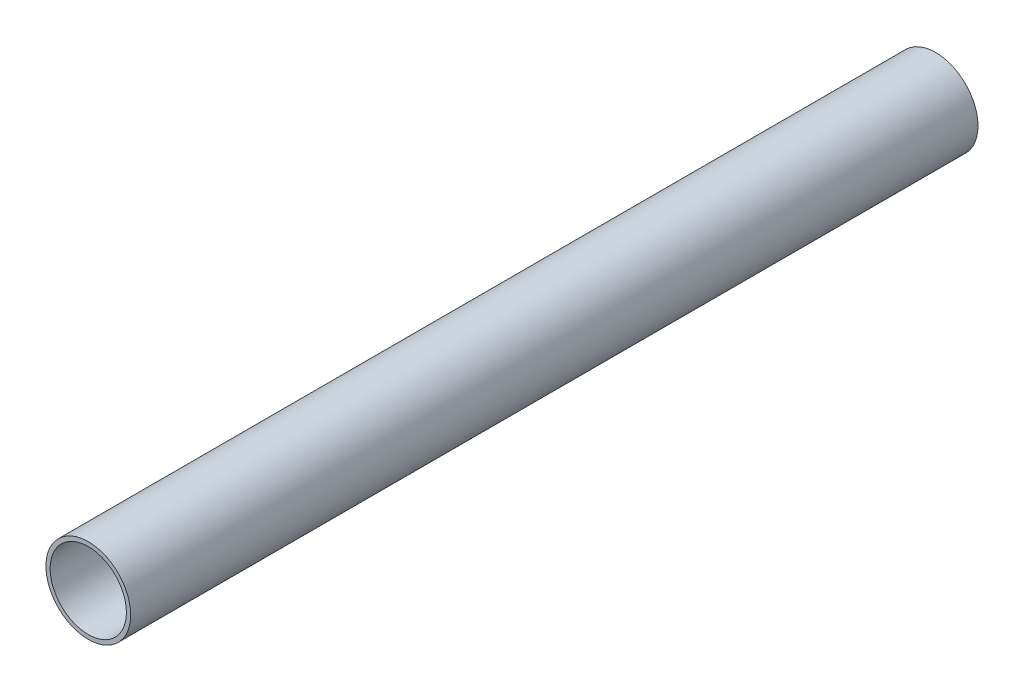
ISO-10303-21;
HEADER;
FILE_DESCRIPTION(('STEP AP214'),'2;1');
FILE_NAME('part.step','',(''),(''),'','','');
FILE_SCHEMA(('AUTOMOTIVE_DESIGN { 1 0 10303 214 1 1 1 1 }'));
ENDSEC;
DATA;
#1=APPLICATION_CONTEXT('core data for automotive mechanical design processes');
#2=APPLICATION_PROTOCOL_DEFINITION('international standard','automotive_design',2000,#1);
#3=PRODUCT_CONTEXT('',#1,'mechanical');
#4=PRODUCT('Part','Part','',(#3));
#5=PRODUCT_RELATED_PRODUCT_CATEGORY('part','',(#4));
#6=PRODUCT_DEFINITION_FORMATION('','',#4);
#7=PRODUCT_DEFINITION_CONTEXT('part definition',#1,'design');
#8=PRODUCT_DEFINITION('design','',#6,#7);
#9=PRODUCT_DEFINITION_SHAPE('','',#8);
#10=(LENGTH_UNIT() NAMED_UNIT(*) SI_UNIT(.MILLI.,.METRE.));
#11=(NAMED_UNIT(*) PLANE_ANGLE_UNIT() SI_UNIT($,.RADIAN.));
#12=(NAMED_UNIT(*) SI_UNIT($,.STERADIAN.) SOLID_ANGLE_UNIT());
#13=UNCERTAINTY_MEASURE_WITH_UNIT(LENGTH_MEASURE(1.E-05),#10,'distance_accuracy_value','');
#14=(GEOMETRIC_REPRESENTATION_CONTEXT(3) GLOBAL_UNCERTAINTY_ASSIGNED_CONTEXT((#13)) GLOBAL_UNIT_ASSIGNED_CONTEXT((#10,
#11,#12)) REPRESENTATION_CONTEXT('',''));
#15=CARTESIAN_POINT('',(0.,0.,0.));
#16=DIRECTION('',(0.,0.,1.));
#17=DIRECTION('',(1.,0.,0.));
#18=AXIS2_PLACEMENT_3D('',#15,#16,#17);
#19=CARTESIAN_POINT('',(0.,0.,300.));
#20=DIRECTION('',(0.,0.,1.));
#21=DIRECTION('',(1.,0.,0.));
#22=AXIS2_PLACEMENT_3D('',#19,#20,#21);
#23=PLANE('',#22);
#24=CARTESIAN_POINT('',(0.,0.,300.));
#25=DIRECTION('',(0.,0.,1.));
#26=DIRECTION('',(1.,0.,0.));
#27=AXIS2_PLACEMENT_3D('',#24,#25,#26);
#28=CIRCLE('',#27,15.);
#29=CARTESIAN_POINT('',(15.,0.,300.));
#30=VERTEX_POINT('',#29);
#31=EDGE_CURVE('E10',#30,#30,#28,.T.);
#32=ORIENTED_EDGE('',*,*,#31,.T.);
#33=EDGE_LOOP('',(#32));
#34=FACE_BOUND('',#33,.T.);
#35=CARTESIAN_POINT('',(0.,0.,300.));
#36=DIRECTION('',(0.,0.,1.));
#37=DIRECTION('',(1.,0.,0.));
#38=AXIS2_PLACEMENT_3D('',#35,#36,#37);
#39=CIRCLE('',#38,13.5);
#40=CARTESIAN_POINT('',(13.5,0.,300.));
#41=VERTEX_POINT('',#40);
#42=EDGE_CURVE('E42',#41,#41,#39,.T.);
#43=ORIENTED_EDGE('',*,*,#42,.F.);
#44=EDGE_LOOP('',(#43));
#45=FACE_BOUND('',#44,.T.);
#46=ADVANCED_FACE('F31',(#34,#45),#23,.T.);
#47=CARTESIAN_POINT('',(0.,0.,0.));
#48=DIRECTION('',(0.,0.,1.));
#49=DIRECTION('',(1.,0.,0.));
#50=AXIS2_PLACEMENT_3D('',#47,#48,#49);
#51=PLANE('',#50);
#52=CARTESIAN_POINT('',(0.,0.,0.));
#53=DIRECTION('',(0.,0.,1.));
#54=DIRECTION('',(1.,0.,0.));
#55=AXIS2_PLACEMENT_3D('',#52,#53,#54);
#56=CIRCLE('',#55,15.);
#57=CARTESIAN_POINT('',(15.,0.,0.));
#58=VERTEX_POINT('',#57);
#59=EDGE_CURVE('E35',#58,#58,#56,.T.);
#60=ORIENTED_EDGE('',*,*,#59,.F.);
#61=EDGE_LOOP('',(#60));
#62=FACE_BOUND('',#61,.T.);
#63=CARTESIAN_POINT('',(0.,0.,0.));
#64=DIRECTION('',(0.,0.,1.));
#65=DIRECTION('',(1.,0.,0.));
#66=AXIS2_PLACEMENT_3D('',#63,#64,#65);
#67=CIRCLE('',#66,13.5);
#68=CARTESIAN_POINT('',(13.5,0.,0.));
#69=VERTEX_POINT('',#68);
#70=EDGE_CURVE('E44',#69,#69,#67,.T.);
#71=ORIENTED_EDGE('',*,*,#70,.T.);
#72=EDGE_LOOP('',(#71));
#73=FACE_BOUND('',#72,.T.);
#74=ADVANCED_FACE('F54',(#62,#73),#51,.F.);
#75=CARTESIAN_POINT('',(0.,0.,300.));
#76=DIRECTION('',(0.,0.,-1.));
#77=DIRECTION('',(-1.,0.,0.));
#78=AXIS2_PLACEMENT_3D('',#75,#76,#77);
#79=CYLINDRICAL_SURFACE('',#78,15.);
#80=ORIENTED_EDGE('',*,*,#31,.F.);
#81=EDGE_LOOP('',(#80));
#82=FACE_BOUND('',#81,.T.);
#83=ORIENTED_EDGE('',*,*,#59,.T.);
#84=EDGE_LOOP('',(#83));
#85=FACE_BOUND('',#84,.T.);
#86=ADVANCED_FACE('F33',(#82,#85),#79,.T.);
#87=CARTESIAN_POINT('',(0.,0.,300.));
#88=DIRECTION('',(0.,0.,-1.));
#89=DIRECTION('',(-1.,0.,0.));
#90=AXIS2_PLACEMENT_3D('',#87,#88,#89);
#91=CYLINDRICAL_SURFACE('',#90,13.5);
#92=ORIENTED_EDGE('',*,*,#42,.T.);
#93=EDGE_LOOP('',(#92));
#94=FACE_BOUND('',#93,.T.);
#95=ORIENTED_EDGE('',*,*,#70,.F.);
#96=EDGE_LOOP('',(#95));
#97=FACE_BOUND('',#96,.T.);
#98=ADVANCED_FACE('F50',(#94,#97),#91,.F.);
#99=CLOSED_SHELL('',(#46,#74,#86,#98));
#100=MANIFOLD_SOLID_BREP('B2',#99);
#101=ADVANCED_BREP_SHAPE_REPRESENTATION('',(#18,#100),#14);
#102=SHAPE_DEFINITION_REPRESENTATION(#9,#101);
ENDSEC;
END-ISO-10303-21;
